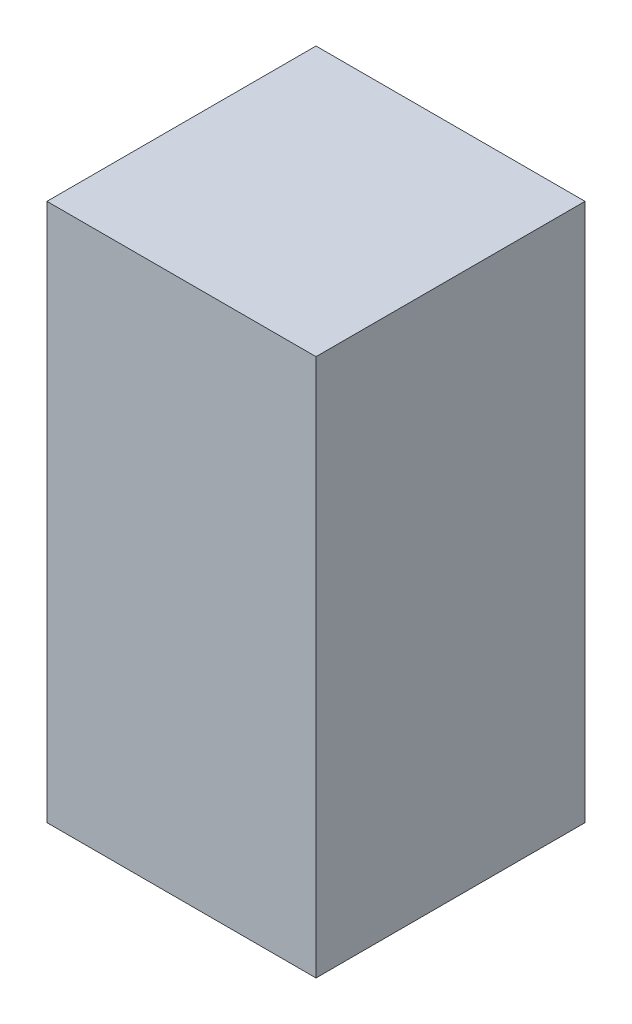
ISO-10303-21;
HEADER;
FILE_DESCRIPTION(('STEP AP214'),'2;1');
FILE_NAME('part.step','',(''),(''),'','','');
FILE_SCHEMA(('AUTOMOTIVE_DESIGN { 1 0 10303 214 1 1 1 1 }'));
ENDSEC;
DATA;
#1=APPLICATION_CONTEXT('core data for automotive mechanical design processes');
#2=APPLICATION_PROTOCOL_DEFINITION('international standard','automotive_design',2000,#1);
#3=PRODUCT_CONTEXT('',#1,'mechanical');
#4=PRODUCT('Part','Part','',(#3));
#5=PRODUCT_RELATED_PRODUCT_CATEGORY('part','',(#4));
#6=PRODUCT_DEFINITION_FORMATION('','',#4);
#7=PRODUCT_DEFINITION_CONTEXT('part definition',#1,'design');
#8=PRODUCT_DEFINITION('design','',#6,#7);
#9=PRODUCT_DEFINITION_SHAPE('','',#8);
#10=(LENGTH_UNIT() NAMED_UNIT(*) SI_UNIT(.MILLI.,.METRE.));
#11=(NAMED_UNIT(*) PLANE_ANGLE_UNIT() SI_UNIT($,.RADIAN.));
#12=(NAMED_UNIT(*) SI_UNIT($,.STERADIAN.) SOLID_ANGLE_UNIT());
#13=UNCERTAINTY_MEASURE_WITH_UNIT(LENGTH_MEASURE(1.E-05),#10,'distance_accuracy_value','');
#14=(GEOMETRIC_REPRESENTATION_CONTEXT(3) GLOBAL_UNCERTAINTY_ASSIGNED_CONTEXT((#13)) GLOBAL_UNIT_ASSIGNED_CONTEXT((#10,
#11,#12)) REPRESENTATION_CONTEXT('',''));
#15=CARTESIAN_POINT('',(0.,0.,0.));
#16=DIRECTION('',(0.,0.,1.));
#17=DIRECTION('',(1.,0.,0.));
#18=AXIS2_PLACEMENT_3D('',#15,#16,#17);
#19=CARTESIAN_POINT('',(-5.,-10.,5.));
#20=DIRECTION('',(1.,0.,0.));
#21=DIRECTION('',(0.,0.,-1.));
#22=AXIS2_PLACEMENT_3D('',#19,#20,#21);
#23=PLANE('',#22);
#24=DIRECTION('',(0.,-1.,0.));
#25=VECTOR('',#24,1.);
#26=CARTESIAN_POINT('',(-5.,-10.,-5.));
#27=LINE('',#26,#25);
#28=CARTESIAN_POINT('',(-5.,10.,-5.));
#29=VERTEX_POINT('',#28);
#30=CARTESIAN_POINT('',(-5.,-10.,-5.));
#31=VERTEX_POINT('',#30);
#32=EDGE_CURVE('E96',#29,#31,#27,.T.);
#33=ORIENTED_EDGE('',*,*,#32,.T.);
#34=DIRECTION('',(0.,0.,-1.));
#35=VECTOR('',#34,1.);
#36=CARTESIAN_POINT('',(-5.,-10.,5.));
#37=LINE('',#36,#35);
#38=CARTESIAN_POINT('',(-5.,-10.,5.));
#39=VERTEX_POINT('',#38);
#40=EDGE_CURVE('E11',#39,#31,#37,.T.);
#41=ORIENTED_EDGE('',*,*,#40,.F.);
#42=DIRECTION('',(0.,-1.,0.));
#43=VECTOR('',#42,1.);
#44=CARTESIAN_POINT('',(-5.,-10.,5.));
#45=LINE('',#44,#43);
#46=CARTESIAN_POINT('',(-5.,10.,5.));
#47=VERTEX_POINT('',#46);
#48=EDGE_CURVE('E84',#47,#39,#45,.T.);
#49=ORIENTED_EDGE('',*,*,#48,.F.);
#50=DIRECTION('',(0.,0.,-1.));
#51=VECTOR('',#50,1.);
#52=CARTESIAN_POINT('',(-5.,10.,5.));
#53=LINE('',#52,#51);
#54=EDGE_CURVE('E92',#47,#29,#53,.T.);
#55=ORIENTED_EDGE('',*,*,#54,.T.);
#56=EDGE_LOOP('',(#33,#41,#49,#55));
#57=FACE_BOUND('',#56,.T.);
#58=ADVANCED_FACE('F33',(#57),#23,.F.);
#59=CARTESIAN_POINT('',(5.,-10.,5.));
#60=DIRECTION('',(0.,1.,0.));
#61=DIRECTION('',(-1.,0.,0.));
#62=AXIS2_PLACEMENT_3D('',#59,#60,#61);
#63=PLANE('',#62);
#64=DIRECTION('',(1.,0.,0.));
#65=VECTOR('',#64,1.);
#66=CARTESIAN_POINT('',(5.,-10.,-5.));
#67=LINE('',#66,#65);
#68=CARTESIAN_POINT('',(5.,-10.,-5.));
#69=VERTEX_POINT('',#68);
#70=EDGE_CURVE('E88',#31,#69,#67,.T.);
#71=ORIENTED_EDGE('',*,*,#70,.T.);
#72=DIRECTION('',(0.,0.,-1.));
#73=VECTOR('',#72,1.);
#74=CARTESIAN_POINT('',(5.,-10.,5.));
#75=LINE('',#74,#73);
#76=CARTESIAN_POINT('',(5.,-10.,5.));
#77=VERTEX_POINT('',#76);
#78=EDGE_CURVE('E41',#77,#69,#75,.T.);
#79=ORIENTED_EDGE('',*,*,#78,.F.);
#80=DIRECTION('',(1.,0.,0.));
#81=VECTOR('',#80,1.);
#82=CARTESIAN_POINT('',(5.,-10.,5.));
#83=LINE('',#82,#81);
#84=EDGE_CURVE('E79',#39,#77,#83,.T.);
#85=ORIENTED_EDGE('',*,*,#84,.F.);
#86=ORIENTED_EDGE('',*,*,#40,.T.);
#87=EDGE_LOOP('',(#71,#79,#85,#86));
#88=FACE_BOUND('',#87,.T.);
#89=ADVANCED_FACE('F87',(#88),#63,.F.);
#90=CARTESIAN_POINT('',(5.,-10.,5.));
#91=DIRECTION('',(-1.,0.,0.));
#92=DIRECTION('',(0.,0.,1.));
#93=AXIS2_PLACEMENT_3D('',#90,#91,#92);
#94=PLANE('',#93);
#95=DIRECTION('',(0.,1.,0.));
#96=VECTOR('',#95,1.);
#97=CARTESIAN_POINT('',(5.,-10.,-5.));
#98=LINE('',#97,#96);
#99=CARTESIAN_POINT('',(5.,10.,-5.));
#100=VERTEX_POINT('',#99);
#101=EDGE_CURVE('E66',#69,#100,#98,.T.);
#102=ORIENTED_EDGE('',*,*,#101,.T.);
#103=DIRECTION('',(0.,0.,-1.));
#104=VECTOR('',#103,1.);
#105=CARTESIAN_POINT('',(5.,10.,5.));
#106=LINE('',#105,#104);
#107=CARTESIAN_POINT('',(5.,10.,5.));
#108=VERTEX_POINT('',#107);
#109=EDGE_CURVE('E89',#108,#100,#106,.T.);
#110=ORIENTED_EDGE('',*,*,#109,.F.);
#111=DIRECTION('',(0.,1.,0.));
#112=VECTOR('',#111,1.);
#113=CARTESIAN_POINT('',(5.,-10.,5.));
#114=LINE('',#113,#112);
#115=EDGE_CURVE('E82',#77,#108,#114,.T.);
#116=ORIENTED_EDGE('',*,*,#115,.F.);
#117=ORIENTED_EDGE('',*,*,#78,.T.);
#118=EDGE_LOOP('',(#102,#110,#116,#117));
#119=FACE_BOUND('',#118,.T.);
#120=ADVANCED_FACE('F90',(#119),#94,.F.);
#121=CARTESIAN_POINT('',(5.,10.,5.));
#122=DIRECTION('',(0.,-1.,0.));
#123=DIRECTION('',(0.,0.,-1.));
#124=AXIS2_PLACEMENT_3D('',#121,#122,#123);
#125=PLANE('',#124);
#126=DIRECTION('',(-1.,0.,0.));
#127=VECTOR('',#126,1.);
#128=CARTESIAN_POINT('',(5.,10.,-5.));
#129=LINE('',#128,#127);
#130=EDGE_CURVE('E72',#100,#29,#129,.T.);
#131=ORIENTED_EDGE('',*,*,#130,.T.);
#132=ORIENTED_EDGE('',*,*,#54,.F.);
#133=DIRECTION('',(-1.,0.,0.));
#134=VECTOR('',#133,1.);
#135=CARTESIAN_POINT('',(5.,10.,5.));
#136=LINE('',#135,#134);
#137=EDGE_CURVE('E49',#108,#47,#136,.T.);
#138=ORIENTED_EDGE('',*,*,#137,.F.);
#139=ORIENTED_EDGE('',*,*,#109,.T.);
#140=EDGE_LOOP('',(#131,#132,#138,#139));
#141=FACE_BOUND('',#140,.T.);
#142=ADVANCED_FACE('F103',(#141),#125,.F.);
#143=CARTESIAN_POINT('',(0.,0.,5.));
#144=DIRECTION('',(0.,0.,1.));
#145=DIRECTION('',(1.,0.,0.));
#146=AXIS2_PLACEMENT_3D('',#143,#144,#145);
#147=PLANE('',#146);
#148=ORIENTED_EDGE('',*,*,#48,.T.);
#149=ORIENTED_EDGE('',*,*,#84,.T.);
#150=ORIENTED_EDGE('',*,*,#115,.T.);
#151=ORIENTED_EDGE('',*,*,#137,.T.);
#152=EDGE_LOOP('',(#148,#149,#150,#151));
#153=FACE_BOUND('',#152,.T.);
#154=ADVANCED_FACE('F80',(#153),#147,.T.);
#155=CARTESIAN_POINT('',(0.,0.,-5.));
#156=DIRECTION('',(0.,0.,1.));
#157=DIRECTION('',(1.,0.,0.));
#158=AXIS2_PLACEMENT_3D('',#155,#156,#157);
#159=PLANE('',#158);
#160=ORIENTED_EDGE('',*,*,#32,.F.);
#161=ORIENTED_EDGE('',*,*,#130,.F.);
#162=ORIENTED_EDGE('',*,*,#101,.F.);
#163=ORIENTED_EDGE('',*,*,#70,.F.);
#164=EDGE_LOOP('',(#160,#161,#162,#163));
#165=FACE_BOUND('',#164,.T.);
#166=ADVANCED_FACE('F106',(#165),#159,.F.);
#167=CLOSED_SHELL('',(#58,#89,#120,#142,#154,#166));
#168=MANIFOLD_SOLID_BREP('B2',#167);
#169=ADVANCED_BREP_SHAPE_REPRESENTATION('',(#18,#168),#14);
#170=SHAPE_DEFINITION_REPRESENTATION(#9,#169);
ENDSEC;
END-ISO-10303-21;
